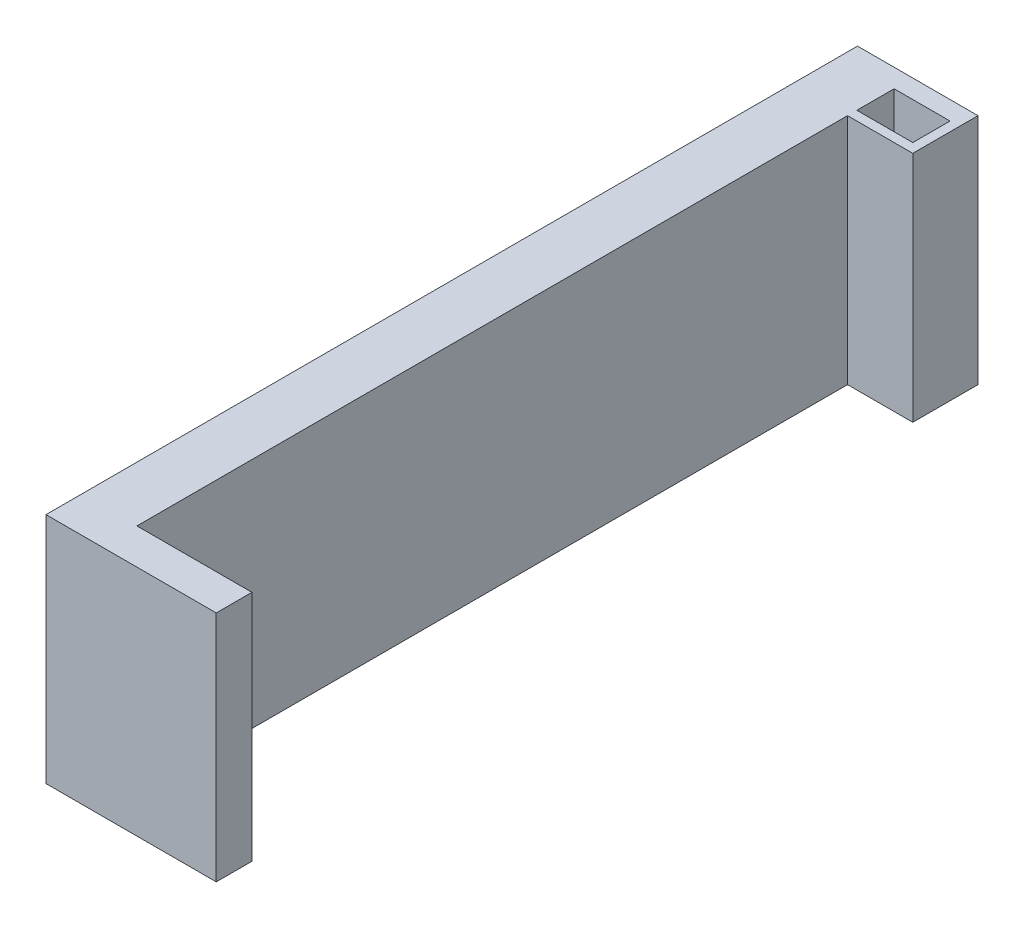
ISO-10303-21;
HEADER;
FILE_DESCRIPTION(('STEP AP214'),'2;1');
FILE_NAME('part.step','',(''),(''),'','','');
FILE_SCHEMA(('AUTOMOTIVE_DESIGN { 1 0 10303 214 1 1 1 1 }'));
ENDSEC;
DATA;
#1=APPLICATION_CONTEXT('core data for automotive mechanical design processes');
#2=APPLICATION_PROTOCOL_DEFINITION('international standard','automotive_design',2000,#1);
#3=PRODUCT_CONTEXT('',#1,'mechanical');
#4=PRODUCT('Part','Part','',(#3));
#5=PRODUCT_RELATED_PRODUCT_CATEGORY('part','',(#4));
#6=PRODUCT_DEFINITION_FORMATION('','',#4);
#7=PRODUCT_DEFINITION_CONTEXT('part definition',#1,'design');
#8=PRODUCT_DEFINITION('design','',#6,#7);
#9=PRODUCT_DEFINITION_SHAPE('','',#8);
#10=(LENGTH_UNIT() NAMED_UNIT(*) SI_UNIT(.MILLI.,.METRE.));
#11=(NAMED_UNIT(*) PLANE_ANGLE_UNIT() SI_UNIT($,.RADIAN.));
#12=(NAMED_UNIT(*) SI_UNIT($,.STERADIAN.) SOLID_ANGLE_UNIT());
#13=UNCERTAINTY_MEASURE_WITH_UNIT(LENGTH_MEASURE(1.E-05),#10,'distance_accuracy_value','');
#14=(GEOMETRIC_REPRESENTATION_CONTEXT(3) GLOBAL_UNCERTAINTY_ASSIGNED_CONTEXT((#13)) GLOBAL_UNIT_ASSIGNED_CONTEXT((#10,
#11,#12)) REPRESENTATION_CONTEXT('',''));
#15=CARTESIAN_POINT('',(0.,0.,0.));
#16=DIRECTION('',(0.,0.,1.));
#17=DIRECTION('',(1.,0.,0.));
#18=AXIS2_PLACEMENT_3D('',#15,#16,#17);
#19=CARTESIAN_POINT('',(2.965,25.,-83.26));
#20=DIRECTION('',(1.,0.,0.));
#21=DIRECTION('',(0.,0.,-1.));
#22=AXIS2_PLACEMENT_3D('',#19,#20,#21);
#23=PLANE('',#22);
#24=DIRECTION('',(0.,0.,1.));
#25=VECTOR('',#24,1.);
#26=CARTESIAN_POINT('',(2.965,25.,-83.26));
#27=LINE('',#26,#25);
#28=CARTESIAN_POINT('',(2.965,25.,-76.26));
#29=VERTEX_POINT('',#28);
#30=CARTESIAN_POINT('',(2.965,25.,0.));
#31=VERTEX_POINT('',#30);
#32=EDGE_CURVE('E213',#29,#31,#27,.T.);
#33=ORIENTED_EDGE('',*,*,#32,.T.);
#34=DIRECTION('',(0.,1.,0.));
#35=VECTOR('',#34,1.);
#36=CARTESIAN_POINT('',(2.965,25.,0.));
#37=LINE('',#36,#35);
#38=CARTESIAN_POINT('',(2.965,0.,0.));
#39=VERTEX_POINT('',#38);
#40=EDGE_CURVE('E154',#39,#31,#37,.T.);
#41=ORIENTED_EDGE('',*,*,#40,.F.);
#42=DIRECTION('',(0.,0.,1.));
#43=VECTOR('',#42,1.);
#44=CARTESIAN_POINT('',(2.965,0.,-83.26));
#45=LINE('',#44,#43);
#46=CARTESIAN_POINT('',(2.965,0.,-76.26));
#47=VERTEX_POINT('',#46);
#48=EDGE_CURVE('E216',#47,#39,#45,.T.);
#49=ORIENTED_EDGE('',*,*,#48,.F.);
#50=DIRECTION('',(0.,-1.,0.));
#51=VECTOR('',#50,1.);
#52=CARTESIAN_POINT('',(2.965,0.,-76.26));
#53=LINE('',#52,#51);
#54=EDGE_CURVE('E170',#29,#47,#53,.T.);
#55=ORIENTED_EDGE('',*,*,#54,.F.);
#56=EDGE_LOOP('',(#33,#41,#49,#55));
#57=FACE_BOUND('',#56,.T.);
#58=ADVANCED_FACE('F38',(#57),#23,.T.);
#59=CARTESIAN_POINT('',(2.965,25.,-81.26));
#60=VERTEX_POINT('',#59);
#61=CARTESIAN_POINT('',(2.965,25.,-77.26));
#62=VERTEX_POINT('',#61);
#63=EDGE_CURVE('E47',#60,#62,#27,.T.);
#64=ORIENTED_EDGE('',*,*,#63,.T.);
#65=DIRECTION('',(0.,1.,0.));
#66=VECTOR('',#65,1.);
#67=CARTESIAN_POINT('',(2.965,0.,-77.26));
#68=LINE('',#67,#66);
#69=CARTESIAN_POINT('',(2.965,0.,-77.26));
#70=VERTEX_POINT('',#69);
#71=EDGE_CURVE('E167',#70,#62,#68,.T.);
#72=ORIENTED_EDGE('',*,*,#71,.F.);
#73=CARTESIAN_POINT('',(2.965,0.,-81.26));
#74=VERTEX_POINT('',#73);
#75=EDGE_CURVE('E214',#74,#70,#45,.T.);
#76=ORIENTED_EDGE('',*,*,#75,.F.);
#77=DIRECTION('',(0.,-1.,0.));
#78=VECTOR('',#77,1.);
#79=CARTESIAN_POINT('',(2.965,25.,-81.26));
#80=LINE('',#79,#78);
#81=EDGE_CURVE('E191',#60,#74,#80,.T.);
#82=ORIENTED_EDGE('',*,*,#81,.F.);
#83=EDGE_LOOP('',(#64,#72,#76,#82));
#84=FACE_BOUND('',#83,.T.);
#85=ADVANCED_FACE('F253',(#84),#23,.T.);
#86=CARTESIAN_POINT('',(8.965,25.,-76.26));
#87=DIRECTION('',(1.,0.,0.));
#88=DIRECTION('',(0.,0.,-1.));
#89=AXIS2_PLACEMENT_3D('',#86,#87,#88);
#90=PLANE('',#89);
#91=DIRECTION('',(0.,-1.,0.));
#92=VECTOR('',#91,1.);
#93=CARTESIAN_POINT('',(8.965,0.,-77.26));
#94=LINE('',#93,#92);
#95=CARTESIAN_POINT('',(8.965,25.,-77.26));
#96=VERTEX_POINT('',#95);
#97=CARTESIAN_POINT('',(8.965,0.,-77.26));
#98=VERTEX_POINT('',#97);
#99=EDGE_CURVE('E140',#96,#98,#94,.T.);
#100=ORIENTED_EDGE('',*,*,#99,.F.);
#101=DIRECTION('',(0.,0.,-1.));
#102=VECTOR('',#101,1.);
#103=CARTESIAN_POINT('',(8.965,25.,-76.26));
#104=LINE('',#103,#102);
#105=CARTESIAN_POINT('',(8.965,25.,-81.26));
#106=VERTEX_POINT('',#105);
#107=EDGE_CURVE('E189',#96,#106,#104,.T.);
#108=ORIENTED_EDGE('',*,*,#107,.T.);
#109=DIRECTION('',(0.,-1.,0.));
#110=VECTOR('',#109,1.);
#111=CARTESIAN_POINT('',(8.965,25.,-81.26));
#112=LINE('',#111,#110);
#113=CARTESIAN_POINT('',(8.965,0.,-81.26));
#114=VERTEX_POINT('',#113);
#115=EDGE_CURVE('E173',#106,#114,#112,.T.);
#116=ORIENTED_EDGE('',*,*,#115,.T.);
#117=DIRECTION('',(0.,0.,-1.));
#118=VECTOR('',#117,1.);
#119=CARTESIAN_POINT('',(8.965,0.,-76.26));
#120=LINE('',#119,#118);
#121=EDGE_CURVE('E185',#98,#114,#120,.T.);
#122=ORIENTED_EDGE('',*,*,#121,.F.);
#123=EDGE_LOOP('',(#100,#108,#116,#122));
#124=FACE_BOUND('',#123,.T.);
#125=ADVANCED_FACE('F258',(#124),#90,.F.);
#126=CARTESIAN_POINT('',(9.965,25.,-81.26));
#127=DIRECTION('',(0.,0.,-1.));
#128=DIRECTION('',(-1.,0.,0.));
#129=AXIS2_PLACEMENT_3D('',#126,#127,#128);
#130=PLANE('',#129);
#131=ORIENTED_EDGE('',*,*,#115,.F.);
#132=DIRECTION('',(-1.,0.,0.));
#133=VECTOR('',#132,1.);
#134=CARTESIAN_POINT('',(9.965,25.,-81.26));
#135=LINE('',#134,#133);
#136=EDGE_CURVE('E63',#106,#60,#135,.T.);
#137=ORIENTED_EDGE('',*,*,#136,.T.);
#138=ORIENTED_EDGE('',*,*,#81,.T.);
#139=DIRECTION('',(-1.,0.,0.));
#140=VECTOR('',#139,1.);
#141=CARTESIAN_POINT('',(9.965,0.,-81.26));
#142=LINE('',#141,#140);
#143=EDGE_CURVE('E200',#114,#74,#142,.T.);
#144=ORIENTED_EDGE('',*,*,#143,.F.);
#145=EDGE_LOOP('',(#131,#137,#138,#144));
#146=FACE_BOUND('',#145,.T.);
#147=ADVANCED_FACE('F255',(#146),#130,.F.);
#148=CARTESIAN_POINT('',(-2.965,0.,-83.26));
#149=DIRECTION('',(-1.,0.,0.));
#150=DIRECTION('',(0.,0.,1.));
#151=AXIS2_PLACEMENT_3D('',#148,#149,#150);
#152=PLANE('',#151);
#153=DIRECTION('',(0.,0.,1.));
#154=VECTOR('',#153,1.);
#155=CARTESIAN_POINT('',(-2.965,0.,-83.26));
#156=LINE('',#155,#154);
#157=CARTESIAN_POINT('',(-2.965,0.,-83.26));
#158=VERTEX_POINT('',#157);
#159=CARTESIAN_POINT('',(-2.965,0.,3.83));
#160=VERTEX_POINT('',#159);
#161=EDGE_CURVE('E42',#158,#160,#156,.T.);
#162=ORIENTED_EDGE('',*,*,#161,.T.);
#163=DIRECTION('',(0.,-1.,0.));
#164=VECTOR('',#163,1.);
#165=CARTESIAN_POINT('',(-2.965,25.,3.83));
#166=LINE('',#165,#164);
#167=CARTESIAN_POINT('',(-2.965,25.,3.83));
#168=VERTEX_POINT('',#167);
#169=EDGE_CURVE('E139',#168,#160,#166,.T.);
#170=ORIENTED_EDGE('',*,*,#169,.F.);
#171=DIRECTION('',(0.,0.,1.));
#172=VECTOR('',#171,1.);
#173=CARTESIAN_POINT('',(-2.965,25.,-83.26));
#174=LINE('',#173,#172);
#175=CARTESIAN_POINT('',(-2.965,25.,-83.26));
#176=VERTEX_POINT('',#175);
#177=EDGE_CURVE('E11',#176,#168,#174,.T.);
#178=ORIENTED_EDGE('',*,*,#177,.F.);
#179=DIRECTION('',(0.,-1.,0.));
#180=VECTOR('',#179,1.);
#181=CARTESIAN_POINT('',(-2.965,0.,-83.26));
#182=LINE('',#181,#180);
#183=EDGE_CURVE('E204',#176,#158,#182,.T.);
#184=ORIENTED_EDGE('',*,*,#183,.T.);
#185=EDGE_LOOP('',(#162,#170,#178,#184));
#186=FACE_BOUND('',#185,.T.);
#187=ADVANCED_FACE('F40',(#186),#152,.T.);
#188=CARTESIAN_POINT('',(-2.965,25.,-83.26));
#189=DIRECTION('',(0.,1.,0.));
#190=DIRECTION('',(0.,0.,1.));
#191=AXIS2_PLACEMENT_3D('',#188,#189,#190);
#192=PLANE('',#191);
#193=ORIENTED_EDGE('',*,*,#32,.F.);
#194=DIRECTION('',(-1.,0.,0.));
#195=VECTOR('',#194,1.);
#196=CARTESIAN_POINT('',(9.965,25.,-76.26));
#197=LINE('',#196,#195);
#198=CARTESIAN_POINT('',(9.965,25.,-76.26));
#199=VERTEX_POINT('',#198);
#200=EDGE_CURVE('E182',#199,#29,#197,.T.);
#201=ORIENTED_EDGE('',*,*,#200,.F.);
#202=DIRECTION('',(0.,0.,1.));
#203=VECTOR('',#202,1.);
#204=CARTESIAN_POINT('',(9.965,25.,-83.26));
#205=LINE('',#204,#203);
#206=CARTESIAN_POINT('',(9.965,25.,-83.26));
#207=VERTEX_POINT('',#206);
#208=EDGE_CURVE('E195',#207,#199,#205,.T.);
#209=ORIENTED_EDGE('',*,*,#208,.F.);
#210=DIRECTION('',(-1.,0.,0.));
#211=VECTOR('',#210,1.);
#212=CARTESIAN_POINT('',(-2.965,25.,-83.26));
#213=LINE('',#212,#211);
#214=EDGE_CURVE('E209',#207,#176,#213,.T.);
#215=ORIENTED_EDGE('',*,*,#214,.T.);
#216=ORIENTED_EDGE('',*,*,#177,.T.);
#217=DIRECTION('',(-1.,0.,0.));
#218=VECTOR('',#217,1.);
#219=CARTESIAN_POINT('',(2.965,25.,3.83));
#220=LINE('',#219,#218);
#221=CARTESIAN_POINT('',(15.305,25.,3.83));
#222=VERTEX_POINT('',#221);
#223=EDGE_CURVE('E164',#222,#168,#220,.T.);
#224=ORIENTED_EDGE('',*,*,#223,.F.);
#225=DIRECTION('',(0.,0.,1.));
#226=VECTOR('',#225,1.);
#227=CARTESIAN_POINT('',(15.305,25.,3.83));
#228=LINE('',#227,#226);
#229=CARTESIAN_POINT('',(15.305,25.,0.));
#230=VERTEX_POINT('',#229);
#231=EDGE_CURVE('E153',#230,#222,#228,.T.);
#232=ORIENTED_EDGE('',*,*,#231,.F.);
#233=DIRECTION('',(-1.,0.,0.));
#234=VECTOR('',#233,1.);
#235=CARTESIAN_POINT('',(15.305,25.,0.));
#236=LINE('',#235,#234);
#237=EDGE_CURVE('E159',#230,#31,#236,.T.);
#238=ORIENTED_EDGE('',*,*,#237,.T.);
#239=EDGE_LOOP('',(#193,#201,#209,#215,#216,#224,#232,#238));
#240=FACE_BOUND('',#239,.T.);
#241=DIRECTION('',(1.,0.,0.));
#242=VECTOR('',#241,1.);
#243=CARTESIAN_POINT('',(-22.0549920063936,25.,-77.26));
#244=LINE('',#243,#242);
#245=EDGE_CURVE('E171',#62,#96,#244,.T.);
#246=ORIENTED_EDGE('',*,*,#245,.F.);
#247=ORIENTED_EDGE('',*,*,#63,.F.);
#248=ORIENTED_EDGE('',*,*,#136,.F.);
#249=ORIENTED_EDGE('',*,*,#107,.F.);
#250=EDGE_LOOP('',(#246,#247,#248,#249));
#251=FACE_BOUND('',#250,.T.);
#252=ADVANCED_FACE('F242',(#240,#251),#192,.T.);
#253=CARTESIAN_POINT('',(-2.965,0.,-83.26));
#254=DIRECTION('',(0.,-1.,0.));
#255=DIRECTION('',(1.,0.,0.));
#256=AXIS2_PLACEMENT_3D('',#253,#254,#255);
#257=PLANE('',#256);
#258=ORIENTED_EDGE('',*,*,#75,.T.);
#259=DIRECTION('',(1.,0.,0.));
#260=VECTOR('',#259,1.);
#261=CARTESIAN_POINT('',(-22.0549920063936,0.,-77.26));
#262=LINE('',#261,#260);
#263=EDGE_CURVE('E176',#70,#98,#262,.T.);
#264=ORIENTED_EDGE('',*,*,#263,.T.);
#265=ORIENTED_EDGE('',*,*,#121,.T.);
#266=ORIENTED_EDGE('',*,*,#143,.T.);
#267=EDGE_LOOP('',(#258,#264,#265,#266));
#268=FACE_BOUND('',#267,.T.);
#269=ORIENTED_EDGE('',*,*,#48,.T.);
#270=DIRECTION('',(-1.,0.,0.));
#271=VECTOR('',#270,1.);
#272=CARTESIAN_POINT('',(15.305,0.,0.));
#273=LINE('',#272,#271);
#274=CARTESIAN_POINT('',(15.305,0.,0.));
#275=VERTEX_POINT('',#274);
#276=EDGE_CURVE('E145',#275,#39,#273,.T.);
#277=ORIENTED_EDGE('',*,*,#276,.F.);
#278=DIRECTION('',(0.,0.,-1.));
#279=VECTOR('',#278,1.);
#280=CARTESIAN_POINT('',(15.305,0.,0.));
#281=LINE('',#280,#279);
#282=CARTESIAN_POINT('',(15.305,0.,3.83));
#283=VERTEX_POINT('',#282);
#284=EDGE_CURVE('E143',#283,#275,#281,.T.);
#285=ORIENTED_EDGE('',*,*,#284,.F.);
#286=DIRECTION('',(1.,0.,0.));
#287=VECTOR('',#286,1.);
#288=CARTESIAN_POINT('',(-2.965,0.,3.83));
#289=LINE('',#288,#287);
#290=EDGE_CURVE('E132',#160,#283,#289,.T.);
#291=ORIENTED_EDGE('',*,*,#290,.F.);
#292=ORIENTED_EDGE('',*,*,#161,.F.);
#293=DIRECTION('',(1.,0.,0.));
#294=VECTOR('',#293,1.);
#295=CARTESIAN_POINT('',(-2.965,0.,-83.26));
#296=LINE('',#295,#294);
#297=CARTESIAN_POINT('',(9.965,0.,-83.26));
#298=VERTEX_POINT('',#297);
#299=EDGE_CURVE('E207',#158,#298,#296,.T.);
#300=ORIENTED_EDGE('',*,*,#299,.T.);
#301=DIRECTION('',(0.,0.,-1.));
#302=VECTOR('',#301,1.);
#303=CARTESIAN_POINT('',(9.965,0.,-81.26));
#304=LINE('',#303,#302);
#305=CARTESIAN_POINT('',(9.965,0.,-76.26));
#306=VERTEX_POINT('',#305);
#307=EDGE_CURVE('E197',#306,#298,#304,.T.);
#308=ORIENTED_EDGE('',*,*,#307,.F.);
#309=DIRECTION('',(1.,0.,0.));
#310=VECTOR('',#309,1.);
#311=CARTESIAN_POINT('',(8.965,0.,-76.26));
#312=LINE('',#311,#310);
#313=EDGE_CURVE('E55',#47,#306,#312,.T.);
#314=ORIENTED_EDGE('',*,*,#313,.F.);
#315=EDGE_LOOP('',(#269,#277,#285,#291,#292,#300,#308,#314));
#316=FACE_BOUND('',#315,.T.);
#317=ADVANCED_FACE('F144',(#268,#316),#257,.T.);
#318=CARTESIAN_POINT('',(0.,0.,-83.26));
#319=DIRECTION('',(0.,0.,-1.));
#320=DIRECTION('',(-1.,0.,0.));
#321=AXIS2_PLACEMENT_3D('',#318,#319,#320);
#322=PLANE('',#321);
#323=ORIENTED_EDGE('',*,*,#183,.F.);
#324=ORIENTED_EDGE('',*,*,#214,.F.);
#325=DIRECTION('',(0.,1.,0.));
#326=VECTOR('',#325,1.);
#327=CARTESIAN_POINT('',(9.965,0.,-83.26));
#328=LINE('',#327,#326);
#329=EDGE_CURVE('E192',#298,#207,#328,.T.);
#330=ORIENTED_EDGE('',*,*,#329,.F.);
#331=ORIENTED_EDGE('',*,*,#299,.F.);
#332=EDGE_LOOP('',(#323,#324,#330,#331));
#333=FACE_BOUND('',#332,.T.);
#334=ADVANCED_FACE('F226',(#333),#322,.T.);
#335=CARTESIAN_POINT('',(9.965,0.,0.));
#336=DIRECTION('',(1.,0.,0.));
#337=DIRECTION('',(0.,0.,-1.));
#338=AXIS2_PLACEMENT_3D('',#335,#336,#337);
#339=PLANE('',#338);
#340=ORIENTED_EDGE('',*,*,#329,.T.);
#341=ORIENTED_EDGE('',*,*,#208,.T.);
#342=DIRECTION('',(0.,1.,0.));
#343=VECTOR('',#342,1.);
#344=CARTESIAN_POINT('',(9.965,0.,-76.26));
#345=LINE('',#344,#343);
#346=EDGE_CURVE('E179',#306,#199,#345,.T.);
#347=ORIENTED_EDGE('',*,*,#346,.F.);
#348=ORIENTED_EDGE('',*,*,#307,.T.);
#349=EDGE_LOOP('',(#340,#341,#347,#348));
#350=FACE_BOUND('',#349,.T.);
#351=ADVANCED_FACE('F229',(#350),#339,.T.);
#352=CARTESIAN_POINT('',(0.,0.,-76.26));
#353=DIRECTION('',(0.,0.,1.));
#354=DIRECTION('',(1.,0.,0.));
#355=AXIS2_PLACEMENT_3D('',#352,#353,#354);
#356=PLANE('',#355);
#357=ORIENTED_EDGE('',*,*,#346,.T.);
#358=ORIENTED_EDGE('',*,*,#200,.T.);
#359=ORIENTED_EDGE('',*,*,#54,.T.);
#360=ORIENTED_EDGE('',*,*,#313,.T.);
#361=EDGE_LOOP('',(#357,#358,#359,#360));
#362=FACE_BOUND('',#361,.T.);
#363=ADVANCED_FACE('F233',(#362),#356,.T.);
#364=CARTESIAN_POINT('',(-22.0549920063936,0.,-77.26));
#365=DIRECTION('',(0.,0.,1.));
#366=DIRECTION('',(1.,0.,0.));
#367=AXIS2_PLACEMENT_3D('',#364,#365,#366);
#368=PLANE('',#367);
#369=ORIENTED_EDGE('',*,*,#263,.F.);
#370=ORIENTED_EDGE('',*,*,#71,.T.);
#371=ORIENTED_EDGE('',*,*,#245,.T.);
#372=ORIENTED_EDGE('',*,*,#99,.T.);
#373=EDGE_LOOP('',(#369,#370,#371,#372));
#374=FACE_BOUND('',#373,.T.);
#375=ADVANCED_FACE('F251',(#374),#368,.F.);
#376=CARTESIAN_POINT('',(0.,0.,3.83));
#377=DIRECTION('',(0.,0.,1.));
#378=DIRECTION('',(1.,0.,0.));
#379=AXIS2_PLACEMENT_3D('',#376,#377,#378);
#380=PLANE('',#379);
#381=ORIENTED_EDGE('',*,*,#223,.T.);
#382=ORIENTED_EDGE('',*,*,#169,.T.);
#383=ORIENTED_EDGE('',*,*,#290,.T.);
#384=DIRECTION('',(0.,-1.,0.));
#385=VECTOR('',#384,1.);
#386=CARTESIAN_POINT('',(15.305,0.,3.83));
#387=LINE('',#386,#385);
#388=EDGE_CURVE('E137',#222,#283,#387,.T.);
#389=ORIENTED_EDGE('',*,*,#388,.F.);
#390=EDGE_LOOP('',(#381,#382,#383,#389));
#391=FACE_BOUND('',#390,.T.);
#392=ADVANCED_FACE('F135',(#391),#380,.T.);
#393=CARTESIAN_POINT('',(15.305,25.,0.));
#394=DIRECTION('',(0.,0.,1.));
#395=DIRECTION('',(1.,0.,0.));
#396=AXIS2_PLACEMENT_3D('',#393,#394,#395);
#397=PLANE('',#396);
#398=ORIENTED_EDGE('',*,*,#40,.T.);
#399=ORIENTED_EDGE('',*,*,#237,.F.);
#400=DIRECTION('',(0.,1.,0.));
#401=VECTOR('',#400,1.);
#402=CARTESIAN_POINT('',(15.305,25.,0.));
#403=LINE('',#402,#401);
#404=EDGE_CURVE('E148',#275,#230,#403,.T.);
#405=ORIENTED_EDGE('',*,*,#404,.F.);
#406=ORIENTED_EDGE('',*,*,#276,.T.);
#407=EDGE_LOOP('',(#398,#399,#405,#406));
#408=FACE_BOUND('',#407,.T.);
#409=ADVANCED_FACE('F240',(#408),#397,.F.);
#410=CARTESIAN_POINT('',(15.305,0.,0.));
#411=DIRECTION('',(-1.,0.,0.));
#412=DIRECTION('',(0.,0.,1.));
#413=AXIS2_PLACEMENT_3D('',#410,#411,#412);
#414=PLANE('',#413);
#415=ORIENTED_EDGE('',*,*,#388,.T.);
#416=ORIENTED_EDGE('',*,*,#284,.T.);
#417=ORIENTED_EDGE('',*,*,#404,.T.);
#418=ORIENTED_EDGE('',*,*,#231,.T.);
#419=EDGE_LOOP('',(#415,#416,#417,#418));
#420=FACE_BOUND('',#419,.T.);
#421=ADVANCED_FACE('F151',(#420),#414,.F.);
#422=CLOSED_SHELL('',(#58,#85,#125,#147,#187,#252,#317,#334,#351,#363,#375,#392,#409,#421));
#423=MANIFOLD_SOLID_BREP('B2',#422);
#424=ADVANCED_BREP_SHAPE_REPRESENTATION('',(#18,#423),#14);
#425=SHAPE_DEFINITION_REPRESENTATION(#9,#424);
ENDSEC;
END-ISO-10303-21;
